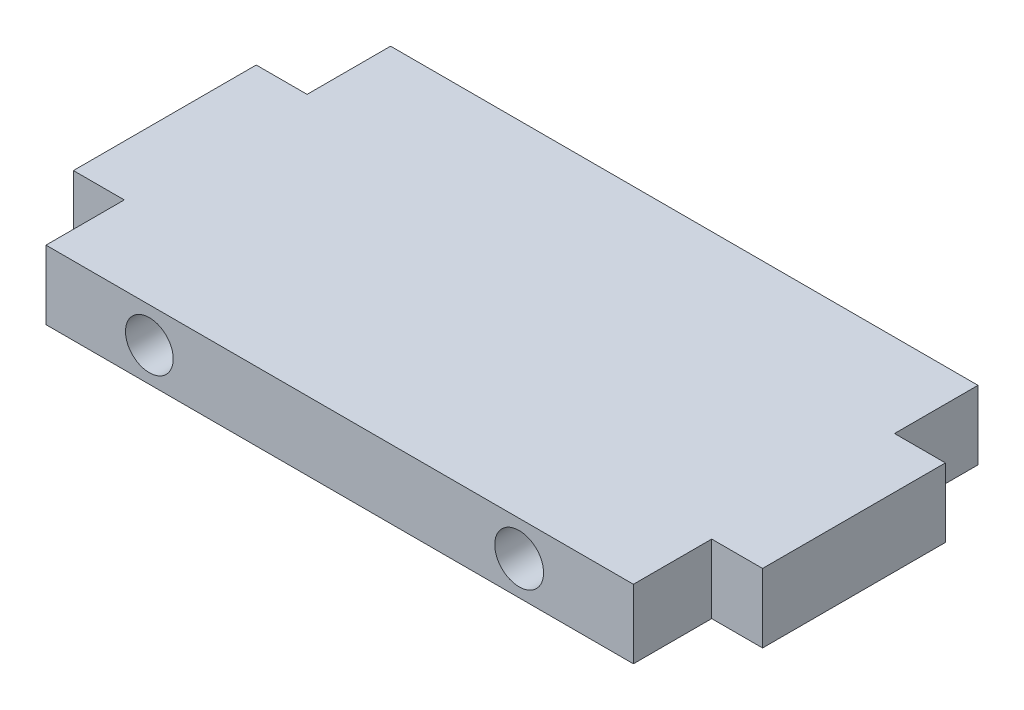
ISO-10303-21;
HEADER;
FILE_DESCRIPTION(('STEP AP214'),'2;1');
FILE_NAME('part.step','',(''),(''),'','','');
FILE_SCHEMA(('AUTOMOTIVE_DESIGN { 1 0 10303 214 1 1 1 1 }'));
ENDSEC;
DATA;
#1=APPLICATION_CONTEXT('core data for automotive mechanical design processes');
#2=APPLICATION_PROTOCOL_DEFINITION('international standard','automotive_design',2000,#1);
#3=PRODUCT_CONTEXT('',#1,'mechanical');
#4=PRODUCT('Part','Part','',(#3));
#5=PRODUCT_RELATED_PRODUCT_CATEGORY('part','',(#4));
#6=PRODUCT_DEFINITION_FORMATION('','',#4);
#7=PRODUCT_DEFINITION_CONTEXT('part definition',#1,'design');
#8=PRODUCT_DEFINITION('design','',#6,#7);
#9=PRODUCT_DEFINITION_SHAPE('','',#8);
#10=(LENGTH_UNIT() NAMED_UNIT(*) SI_UNIT(.MILLI.,.METRE.));
#11=(NAMED_UNIT(*) PLANE_ANGLE_UNIT() SI_UNIT($,.RADIAN.));
#12=(NAMED_UNIT(*) SI_UNIT($,.STERADIAN.) SOLID_ANGLE_UNIT());
#13=UNCERTAINTY_MEASURE_WITH_UNIT(LENGTH_MEASURE(1.E-05),#10,'distance_accuracy_value','');
#14=(GEOMETRIC_REPRESENTATION_CONTEXT(3) GLOBAL_UNCERTAINTY_ASSIGNED_CONTEXT((#13)) GLOBAL_UNIT_ASSIGNED_CONTEXT((#10,
#11,#12)) REPRESENTATION_CONTEXT('',''));
#15=CARTESIAN_POINT('',(0.,0.,0.));
#16=DIRECTION('',(0.,0.,1.));
#17=DIRECTION('',(1.,0.,0.));
#18=AXIS2_PLACEMENT_3D('',#15,#16,#17);
#19=CARTESIAN_POINT('',(-100.098911353033,-20.32,-40.9353032659408));
#20=DIRECTION('',(-1.,0.,0.));
#21=DIRECTION('',(0.,0.,1.));
#22=AXIS2_PLACEMENT_3D('',#19,#20,#21);
#23=PLANE('',#22);
#24=DIRECTION('',(0.,-1.,0.));
#25=VECTOR('',#24,1.);
#26=CARTESIAN_POINT('',(-100.098911353033,-20.32,22.5828458871156));
#27=LINE('',#26,#25);
#28=CARTESIAN_POINT('',(-100.098911353033,0.,22.5828458871156));
#29=VERTEX_POINT('',#28);
#30=CARTESIAN_POINT('',(-100.098911353033,-20.32,22.5828458871156));
#31=VERTEX_POINT('',#30);
#32=EDGE_CURVE('E195',#29,#31,#27,.T.);
#33=ORIENTED_EDGE('',*,*,#32,.F.);
#34=DIRECTION('',(0.,0.,1.));
#35=VECTOR('',#34,1.);
#36=CARTESIAN_POINT('',(-100.098911353033,0.,-40.9353032659408));
#37=LINE('',#36,#35);
#38=CARTESIAN_POINT('',(-100.098911353033,0.,-31.3220629630276));
#39=VERTEX_POINT('',#38);
#40=EDGE_CURVE('E153',#39,#29,#37,.T.);
#41=ORIENTED_EDGE('',*,*,#40,.F.);
#42=DIRECTION('',(0.,-1.,0.));
#43=VECTOR('',#42,1.);
#44=CARTESIAN_POINT('',(-100.098911353033,-20.32,-31.3220629630276));
#45=LINE('',#44,#43);
#46=CARTESIAN_POINT('',(-100.098911353033,-20.32,-31.3220629630276));
#47=VERTEX_POINT('',#46);
#48=EDGE_CURVE('E192',#39,#47,#45,.T.);
#49=ORIENTED_EDGE('',*,*,#48,.T.);
#50=DIRECTION('',(0.,0.,1.));
#51=VECTOR('',#50,1.);
#52=CARTESIAN_POINT('',(-100.098911353033,-20.32,-40.9353032659408));
#53=LINE('',#52,#51);
#54=EDGE_CURVE('E210',#47,#31,#53,.T.);
#55=ORIENTED_EDGE('',*,*,#54,.T.);
#56=EDGE_LOOP('',(#33,#41,#49,#55));
#57=FACE_BOUND('',#56,.T.);
#58=ADVANCED_FACE('F37',(#57),#23,.T.);
#59=CARTESIAN_POINT('',(103.101088646967,-20.32,-40.9353032659408));
#60=DIRECTION('',(1.,0.,0.));
#61=DIRECTION('',(0.,0.,-1.));
#62=AXIS2_PLACEMENT_3D('',#59,#60,#61);
#63=PLANE('',#62);
#64=DIRECTION('',(0.,-1.,0.));
#65=VECTOR('',#64,1.);
#66=CARTESIAN_POINT('',(103.101088646967,-20.32,-31.3220629630276));
#67=LINE('',#66,#65);
#68=CARTESIAN_POINT('',(103.101088646967,0.,-31.3220629630276));
#69=VERTEX_POINT('',#68);
#70=CARTESIAN_POINT('',(103.101088646967,-20.32,-31.3220629630276));
#71=VERTEX_POINT('',#70);
#72=EDGE_CURVE('E200',#69,#71,#67,.T.);
#73=ORIENTED_EDGE('',*,*,#72,.F.);
#74=DIRECTION('',(0.,0.,-1.));
#75=VECTOR('',#74,1.);
#76=CARTESIAN_POINT('',(103.101088646967,0.,-40.9353032659408));
#77=LINE('',#76,#75);
#78=CARTESIAN_POINT('',(103.101088646967,0.,22.5828458871156));
#79=VERTEX_POINT('',#78);
#80=EDGE_CURVE('E202',#79,#69,#77,.T.);
#81=ORIENTED_EDGE('',*,*,#80,.F.);
#82=DIRECTION('',(0.,-1.,0.));
#83=VECTOR('',#82,1.);
#84=CARTESIAN_POINT('',(103.101088646967,-20.32,22.5828458871156));
#85=LINE('',#84,#83);
#86=CARTESIAN_POINT('',(103.101088646967,-20.32,22.5828458871156));
#87=VERTEX_POINT('',#86);
#88=EDGE_CURVE('E197',#79,#87,#85,.T.);
#89=ORIENTED_EDGE('',*,*,#88,.T.);
#90=DIRECTION('',(0.,0.,-1.));
#91=VECTOR('',#90,1.);
#92=CARTESIAN_POINT('',(103.101088646967,-20.32,-40.9353032659408));
#93=LINE('',#92,#91);
#94=EDGE_CURVE('E203',#87,#71,#93,.T.);
#95=ORIENTED_EDGE('',*,*,#94,.T.);
#96=EDGE_LOOP('',(#73,#81,#89,#95));
#97=FACE_BOUND('',#96,.T.);
#98=ADVANCED_FACE('F39',(#97),#63,.T.);
#99=CARTESIAN_POINT('',(88.1010886469673,-20.32,30.6646967340591));
#100=DIRECTION('',(0.,1.,0.));
#101=DIRECTION('',(0.,0.,1.));
#102=AXIS2_PLACEMENT_3D('',#99,#100,#101);
#103=PLANE('',#102);
#104=DIRECTION('',(0.,0.,1.));
#105=VECTOR('',#104,1.);
#106=CARTESIAN_POINT('',(88.1010886469672,-20.32,-55.9353032659409));
#107=LINE('',#106,#105);
#108=CARTESIAN_POINT('',(88.1010886469672,-20.32,-55.9353032659409));
#109=VERTEX_POINT('',#108);
#110=CARTESIAN_POINT('',(88.1010886469672,-20.32,-31.3220629630276));
#111=VERTEX_POINT('',#110);
#112=EDGE_CURVE('E173',#109,#111,#107,.T.);
#113=ORIENTED_EDGE('',*,*,#112,.T.);
#114=DIRECTION('',(1.,0.,0.));
#115=VECTOR('',#114,1.);
#116=CARTESIAN_POINT('',(88.1010886469672,-20.32,-31.3220629630276));
#117=LINE('',#116,#115);
#118=EDGE_CURVE('E178',#111,#71,#117,.T.);
#119=ORIENTED_EDGE('',*,*,#118,.T.);
#120=ORIENTED_EDGE('',*,*,#94,.F.);
#121=DIRECTION('',(1.,0.,0.));
#122=VECTOR('',#121,1.);
#123=CARTESIAN_POINT('',(88.1010886469672,-20.32,22.5828458871156));
#124=LINE('',#123,#122);
#125=CARTESIAN_POINT('',(88.1010886469672,-20.32,22.5828458871156));
#126=VERTEX_POINT('',#125);
#127=EDGE_CURVE('E167',#126,#87,#124,.T.);
#128=ORIENTED_EDGE('',*,*,#127,.F.);
#129=DIRECTION('',(0.,0.,-1.));
#130=VECTOR('',#129,1.);
#131=CARTESIAN_POINT('',(88.1010886469672,-20.32,45.6646967340591));
#132=LINE('',#131,#130);
#133=CARTESIAN_POINT('',(88.1010886469672,-20.32,45.6646967340591));
#134=VERTEX_POINT('',#133);
#135=EDGE_CURVE('E162',#134,#126,#132,.T.);
#136=ORIENTED_EDGE('',*,*,#135,.F.);
#137=DIRECTION('',(1.,0.,0.));
#138=VECTOR('',#137,1.);
#139=CARTESIAN_POINT('',(-85.0989113530325,-20.32,45.6646967340591));
#140=LINE('',#139,#138);
#141=CARTESIAN_POINT('',(-85.0989113530325,-20.32,45.6646967340591));
#142=VERTEX_POINT('',#141);
#143=EDGE_CURVE('E213',#142,#134,#140,.T.);
#144=ORIENTED_EDGE('',*,*,#143,.F.);
#145=DIRECTION('',(0.,0.,-1.));
#146=VECTOR('',#145,1.);
#147=CARTESIAN_POINT('',(-85.0989113530325,-20.32,45.6646967340591));
#148=LINE('',#147,#146);
#149=CARTESIAN_POINT('',(-85.0989113530325,-20.32,22.5828458871156));
#150=VERTEX_POINT('',#149);
#151=EDGE_CURVE('E139',#142,#150,#148,.T.);
#152=ORIENTED_EDGE('',*,*,#151,.T.);
#153=DIRECTION('',(-1.,0.,0.));
#154=VECTOR('',#153,1.);
#155=CARTESIAN_POINT('',(-85.0989113530325,-20.32,22.5828458871156));
#156=LINE('',#155,#154);
#157=EDGE_CURVE('E136',#150,#31,#156,.T.);
#158=ORIENTED_EDGE('',*,*,#157,.T.);
#159=ORIENTED_EDGE('',*,*,#54,.F.);
#160=DIRECTION('',(-1.,0.,0.));
#161=VECTOR('',#160,1.);
#162=CARTESIAN_POINT('',(-85.0989113530327,-20.32,-31.3220629630276));
#163=LINE('',#162,#161);
#164=CARTESIAN_POINT('',(-85.0989113530327,-20.32,-31.3220629630276));
#165=VERTEX_POINT('',#164);
#166=EDGE_CURVE('E184',#165,#47,#163,.T.);
#167=ORIENTED_EDGE('',*,*,#166,.F.);
#168=DIRECTION('',(0.,0.,1.));
#169=VECTOR('',#168,1.);
#170=CARTESIAN_POINT('',(-85.0989113530327,-20.32,-55.9353032659409));
#171=LINE('',#170,#169);
#172=CARTESIAN_POINT('',(-85.0989113530327,-20.32,-55.9353032659409));
#173=VERTEX_POINT('',#172);
#174=EDGE_CURVE('E186',#173,#165,#171,.T.);
#175=ORIENTED_EDGE('',*,*,#174,.F.);
#176=DIRECTION('',(-1.,0.,0.));
#177=VECTOR('',#176,1.);
#178=CARTESIAN_POINT('',(-85.0989113530325,-20.32,-55.9353032659409));
#179=LINE('',#178,#177);
#180=EDGE_CURVE('E206',#109,#173,#179,.T.);
#181=ORIENTED_EDGE('',*,*,#180,.F.);
#182=EDGE_LOOP('',(#113,#119,#120,#128,#136,#144,#152,#158,#159,#167,#175,#181));
#183=FACE_BOUND('',#182,.T.);
#184=ADVANCED_FACE('F253',(#183),#103,.F.);
#185=CARTESIAN_POINT('',(88.1010886469673,0.,30.6646967340591));
#186=DIRECTION('',(0.,1.,0.));
#187=DIRECTION('',(0.,0.,1.));
#188=AXIS2_PLACEMENT_3D('',#185,#186,#187);
#189=PLANE('',#188);
#190=DIRECTION('',(1.,0.,0.));
#191=VECTOR('',#190,1.);
#192=CARTESIAN_POINT('',(88.1010886469672,0.,-31.3220629630276));
#193=LINE('',#192,#191);
#194=CARTESIAN_POINT('',(88.1010886469672,0.,-31.3220629630276));
#195=VERTEX_POINT('',#194);
#196=EDGE_CURVE('E163',#195,#69,#193,.T.);
#197=ORIENTED_EDGE('',*,*,#196,.F.);
#198=DIRECTION('',(0.,0.,1.));
#199=VECTOR('',#198,1.);
#200=CARTESIAN_POINT('',(88.1010886469672,0.,-55.9353032659409));
#201=LINE('',#200,#199);
#202=CARTESIAN_POINT('',(88.1010886469672,0.,-55.9353032659409));
#203=VERTEX_POINT('',#202);
#204=EDGE_CURVE('E175',#203,#195,#201,.T.);
#205=ORIENTED_EDGE('',*,*,#204,.F.);
#206=DIRECTION('',(-1.,0.,0.));
#207=VECTOR('',#206,1.);
#208=CARTESIAN_POINT('',(-85.0989113530325,0.,-55.9353032659409));
#209=LINE('',#208,#207);
#210=CARTESIAN_POINT('',(-85.0989113530327,0.,-55.9353032659409));
#211=VERTEX_POINT('',#210);
#212=EDGE_CURVE('E218',#203,#211,#209,.T.);
#213=ORIENTED_EDGE('',*,*,#212,.T.);
#214=DIRECTION('',(0.,0.,1.));
#215=VECTOR('',#214,1.);
#216=CARTESIAN_POINT('',(-85.0989113530327,0.,-55.9353032659409));
#217=LINE('',#216,#215);
#218=CARTESIAN_POINT('',(-85.0989113530327,0.,-31.3220629630276));
#219=VERTEX_POINT('',#218);
#220=EDGE_CURVE('E155',#211,#219,#217,.T.);
#221=ORIENTED_EDGE('',*,*,#220,.T.);
#222=DIRECTION('',(-1.,0.,0.));
#223=VECTOR('',#222,1.);
#224=CARTESIAN_POINT('',(-85.0989113530327,0.,-31.3220629630276));
#225=LINE('',#224,#223);
#226=EDGE_CURVE('E62',#219,#39,#225,.T.);
#227=ORIENTED_EDGE('',*,*,#226,.T.);
#228=ORIENTED_EDGE('',*,*,#40,.T.);
#229=DIRECTION('',(-1.,0.,0.));
#230=VECTOR('',#229,1.);
#231=CARTESIAN_POINT('',(-85.0989113530325,0.,22.5828458871156));
#232=LINE('',#231,#230);
#233=CARTESIAN_POINT('',(-85.0989113530325,0.,22.5828458871156));
#234=VERTEX_POINT('',#233);
#235=EDGE_CURVE('E133',#234,#29,#232,.T.);
#236=ORIENTED_EDGE('',*,*,#235,.F.);
#237=DIRECTION('',(0.,0.,-1.));
#238=VECTOR('',#237,1.);
#239=CARTESIAN_POINT('',(-85.0989113530325,0.,45.6646967340591));
#240=LINE('',#239,#238);
#241=CARTESIAN_POINT('',(-85.0989113530325,0.,45.6646967340591));
#242=VERTEX_POINT('',#241);
#243=EDGE_CURVE('E142',#242,#234,#240,.T.);
#244=ORIENTED_EDGE('',*,*,#243,.F.);
#245=DIRECTION('',(1.,0.,0.));
#246=VECTOR('',#245,1.);
#247=CARTESIAN_POINT('',(-85.0989113530325,0.,45.6646967340591));
#248=LINE('',#247,#246);
#249=CARTESIAN_POINT('',(88.1010886469672,0.,45.6646967340591));
#250=VERTEX_POINT('',#249);
#251=EDGE_CURVE('E207',#242,#250,#248,.T.);
#252=ORIENTED_EDGE('',*,*,#251,.T.);
#253=DIRECTION('',(0.,0.,-1.));
#254=VECTOR('',#253,1.);
#255=CARTESIAN_POINT('',(88.1010886469672,0.,45.6646967340591));
#256=LINE('',#255,#254);
#257=CARTESIAN_POINT('',(88.1010886469673,0.,22.5828458871156));
#258=VERTEX_POINT('',#257);
#259=EDGE_CURVE('E164',#250,#258,#256,.T.);
#260=ORIENTED_EDGE('',*,*,#259,.T.);
#261=DIRECTION('',(1.,0.,0.));
#262=VECTOR('',#261,1.);
#263=CARTESIAN_POINT('',(88.1010886469672,0.,22.5828458871156));
#264=LINE('',#263,#262);
#265=EDGE_CURVE('E54',#258,#79,#264,.T.);
#266=ORIENTED_EDGE('',*,*,#265,.T.);
#267=ORIENTED_EDGE('',*,*,#80,.T.);
#268=EDGE_LOOP('',(#197,#205,#213,#221,#227,#228,#236,#244,#252,#260,#266,#267));
#269=FACE_BOUND('',#268,.T.);
#270=ADVANCED_FACE('F151',(#269),#189,.T.);
#271=CARTESIAN_POINT('',(-85.0989113530325,-20.32,45.6646967340591));
#272=DIRECTION('',(0.,0.,1.));
#273=DIRECTION('',(1.,0.,0.));
#274=AXIS2_PLACEMENT_3D('',#271,#272,#273);
#275=PLANE('',#274);
#276=CARTESIAN_POINT('',(-54.6243349143324,-10.3131389455966,45.6646967340591));
#277=DIRECTION('',(0.,0.,1.));
#278=DIRECTION('',(1.,0.,0.));
#279=AXIS2_PLACEMENT_3D('',#276,#277,#278);
#280=CIRCLE('',#279,7.0393960649716);
#281=CARTESIAN_POINT('',(-47.5849388493608,-10.3131389455966,45.6646967340591));
#282=VERTEX_POINT('',#281);
#283=EDGE_CURVE('E295',#282,#282,#280,.T.);
#284=ORIENTED_EDGE('',*,*,#283,.F.);
#285=EDGE_LOOP('',(#284));
#286=FACE_BOUND('',#285,.T.);
#287=CARTESIAN_POINT('',(54.4105943507301,-10.3131389455966,45.6646967340591));
#288=DIRECTION('',(0.,0.,1.));
#289=DIRECTION('',(1.,0.,0.));
#290=AXIS2_PLACEMENT_3D('',#287,#288,#289);
#291=CIRCLE('',#290,7.19915939644469);
#292=CARTESIAN_POINT('',(61.6097537471748,-10.3131389455966,45.6646967340591));
#293=VERTEX_POINT('',#292);
#294=EDGE_CURVE('E297',#293,#293,#291,.T.);
#295=ORIENTED_EDGE('',*,*,#294,.F.);
#296=EDGE_LOOP('',(#295));
#297=FACE_BOUND('',#296,.T.);
#298=ORIENTED_EDGE('',*,*,#251,.F.);
#299=DIRECTION('',(0.,1.,0.));
#300=VECTOR('',#299,1.);
#301=CARTESIAN_POINT('',(-85.0989113530325,-20.32,45.6646967340591));
#302=LINE('',#301,#300);
#303=EDGE_CURVE('E46',#142,#242,#302,.T.);
#304=ORIENTED_EDGE('',*,*,#303,.F.);
#305=ORIENTED_EDGE('',*,*,#143,.T.);
#306=DIRECTION('',(0.,1.,0.));
#307=VECTOR('',#306,1.);
#308=CARTESIAN_POINT('',(88.1010886469672,-20.32,45.6646967340591));
#309=LINE('',#308,#307);
#310=EDGE_CURVE('E11',#134,#250,#309,.T.);
#311=ORIENTED_EDGE('',*,*,#310,.T.);
#312=EDGE_LOOP('',(#298,#304,#305,#311));
#313=FACE_BOUND('',#312,.T.);
#314=ADVANCED_FACE('F235',(#286,#297,#313),#275,.T.);
#315=CARTESIAN_POINT('',(-85.0989113530325,-20.32,-55.9353032659409));
#316=DIRECTION('',(0.,0.,-1.));
#317=DIRECTION('',(-1.,0.,0.));
#318=AXIS2_PLACEMENT_3D('',#315,#316,#317);
#319=PLANE('',#318);
#320=CARTESIAN_POINT('',(-54.6243349143324,-10.3131389455966,-55.9353032659409));
#321=DIRECTION('',(0.,0.,1.));
#322=DIRECTION('',(1.,0.,0.));
#323=AXIS2_PLACEMENT_3D('',#320,#321,#322);
#324=CIRCLE('',#323,7.0393960649716);
#325=CARTESIAN_POINT('',(-47.5849388493608,-10.3131389455966,-55.9353032659409));
#326=VERTEX_POINT('',#325);
#327=EDGE_CURVE('E292',#326,#326,#324,.T.);
#328=ORIENTED_EDGE('',*,*,#327,.T.);
#329=EDGE_LOOP('',(#328));
#330=FACE_BOUND('',#329,.T.);
#331=CARTESIAN_POINT('',(54.4105943507301,-10.3131389455966,-55.9353032659409));
#332=DIRECTION('',(0.,0.,1.));
#333=DIRECTION('',(1.,0.,0.));
#334=AXIS2_PLACEMENT_3D('',#331,#332,#333);
#335=CIRCLE('',#334,7.19915939644469);
#336=CARTESIAN_POINT('',(61.6097537471748,-10.3131389455966,-55.9353032659409));
#337=VERTEX_POINT('',#336);
#338=EDGE_CURVE('E174',#337,#337,#335,.T.);
#339=ORIENTED_EDGE('',*,*,#338,.T.);
#340=EDGE_LOOP('',(#339));
#341=FACE_BOUND('',#340,.T.);
#342=ORIENTED_EDGE('',*,*,#212,.F.);
#343=DIRECTION('',(0.,1.,0.));
#344=VECTOR('',#343,1.);
#345=CARTESIAN_POINT('',(88.1010886469672,-20.32,-55.9353032659409));
#346=LINE('',#345,#344);
#347=EDGE_CURVE('E41',#109,#203,#346,.T.);
#348=ORIENTED_EDGE('',*,*,#347,.F.);
#349=ORIENTED_EDGE('',*,*,#180,.T.);
#350=DIRECTION('',(0.,1.,0.));
#351=VECTOR('',#350,1.);
#352=CARTESIAN_POINT('',(-85.0989113530325,-20.32,-55.9353032659409));
#353=LINE('',#352,#351);
#354=EDGE_CURVE('E223',#173,#211,#353,.T.);
#355=ORIENTED_EDGE('',*,*,#354,.T.);
#356=EDGE_LOOP('',(#342,#348,#349,#355));
#357=FACE_BOUND('',#356,.T.);
#358=ADVANCED_FACE('F232',(#330,#341,#357),#319,.T.);
#359=CARTESIAN_POINT('',(-85.0989113530327,-20.32,-31.3220629630276));
#360=DIRECTION('',(0.,0.,-1.));
#361=DIRECTION('',(-1.,0.,0.));
#362=AXIS2_PLACEMENT_3D('',#359,#360,#361);
#363=PLANE('',#362);
#364=ORIENTED_EDGE('',*,*,#226,.F.);
#365=DIRECTION('',(0.,1.,0.));
#366=VECTOR('',#365,1.);
#367=CARTESIAN_POINT('',(-85.0989113530327,-20.32,-31.3220629630276));
#368=LINE('',#367,#366);
#369=EDGE_CURVE('E187',#165,#219,#368,.T.);
#370=ORIENTED_EDGE('',*,*,#369,.F.);
#371=ORIENTED_EDGE('',*,*,#166,.T.);
#372=ORIENTED_EDGE('',*,*,#48,.F.);
#373=EDGE_LOOP('',(#364,#370,#371,#372));
#374=FACE_BOUND('',#373,.T.);
#375=ADVANCED_FACE('F234',(#374),#363,.T.);
#376=CARTESIAN_POINT('',(-85.0989113530327,-20.32,-55.9353032659409));
#377=DIRECTION('',(-1.,0.,0.));
#378=DIRECTION('',(0.,0.,1.));
#379=AXIS2_PLACEMENT_3D('',#376,#377,#378);
#380=PLANE('',#379);
#381=ORIENTED_EDGE('',*,*,#220,.F.);
#382=ORIENTED_EDGE('',*,*,#354,.F.);
#383=ORIENTED_EDGE('',*,*,#174,.T.);
#384=ORIENTED_EDGE('',*,*,#369,.T.);
#385=EDGE_LOOP('',(#381,#382,#383,#384));
#386=FACE_BOUND('',#385,.T.);
#387=ADVANCED_FACE('F241',(#386),#380,.T.);
#388=CARTESIAN_POINT('',(-85.0989113530325,-20.32,22.5828458871156));
#389=DIRECTION('',(0.,0.,-1.));
#390=DIRECTION('',(-1.,0.,0.));
#391=AXIS2_PLACEMENT_3D('',#388,#389,#390);
#392=PLANE('',#391);
#393=ORIENTED_EDGE('',*,*,#32,.T.);
#394=ORIENTED_EDGE('',*,*,#157,.F.);
#395=DIRECTION('',(0.,1.,0.));
#396=VECTOR('',#395,1.);
#397=CARTESIAN_POINT('',(-85.0989113530325,-20.32,22.5828458871156));
#398=LINE('',#397,#396);
#399=EDGE_CURVE('E129',#150,#234,#398,.T.);
#400=ORIENTED_EDGE('',*,*,#399,.T.);
#401=ORIENTED_EDGE('',*,*,#235,.T.);
#402=EDGE_LOOP('',(#393,#394,#400,#401));
#403=FACE_BOUND('',#402,.T.);
#404=ADVANCED_FACE('F131',(#403),#392,.F.);
#405=CARTESIAN_POINT('',(-85.0989113530325,-20.32,45.6646967340591));
#406=DIRECTION('',(1.,0.,0.));
#407=DIRECTION('',(0.,0.,-1.));
#408=AXIS2_PLACEMENT_3D('',#405,#406,#407);
#409=PLANE('',#408);
#410=ORIENTED_EDGE('',*,*,#243,.T.);
#411=ORIENTED_EDGE('',*,*,#399,.F.);
#412=ORIENTED_EDGE('',*,*,#151,.F.);
#413=ORIENTED_EDGE('',*,*,#303,.T.);
#414=EDGE_LOOP('',(#410,#411,#412,#413));
#415=FACE_BOUND('',#414,.T.);
#416=ADVANCED_FACE('F143',(#415),#409,.F.);
#417=CARTESIAN_POINT('',(88.1010886469672,-20.32,22.5828458871156));
#418=DIRECTION('',(0.,0.,1.));
#419=DIRECTION('',(1.,0.,0.));
#420=AXIS2_PLACEMENT_3D('',#417,#418,#419);
#421=PLANE('',#420);
#422=ORIENTED_EDGE('',*,*,#265,.F.);
#423=DIRECTION('',(0.,1.,0.));
#424=VECTOR('',#423,1.);
#425=CARTESIAN_POINT('',(88.1010886469672,-20.32,22.5828458871156));
#426=LINE('',#425,#424);
#427=EDGE_CURVE('E160',#126,#258,#426,.T.);
#428=ORIENTED_EDGE('',*,*,#427,.F.);
#429=ORIENTED_EDGE('',*,*,#127,.T.);
#430=ORIENTED_EDGE('',*,*,#88,.F.);
#431=EDGE_LOOP('',(#422,#428,#429,#430));
#432=FACE_BOUND('',#431,.T.);
#433=ADVANCED_FACE('F274',(#432),#421,.T.);
#434=CARTESIAN_POINT('',(88.1010886469672,-20.32,45.6646967340591));
#435=DIRECTION('',(1.,0.,0.));
#436=DIRECTION('',(0.,0.,-1.));
#437=AXIS2_PLACEMENT_3D('',#434,#435,#436);
#438=PLANE('',#437);
#439=ORIENTED_EDGE('',*,*,#259,.F.);
#440=ORIENTED_EDGE('',*,*,#310,.F.);
#441=ORIENTED_EDGE('',*,*,#135,.T.);
#442=ORIENTED_EDGE('',*,*,#427,.T.);
#443=EDGE_LOOP('',(#439,#440,#441,#442));
#444=FACE_BOUND('',#443,.T.);
#445=ADVANCED_FACE('F270',(#444),#438,.T.);
#446=CARTESIAN_POINT('',(88.1010886469672,-20.32,-31.3220629630276));
#447=DIRECTION('',(0.,0.,1.));
#448=DIRECTION('',(1.,0.,0.));
#449=AXIS2_PLACEMENT_3D('',#446,#447,#448);
#450=PLANE('',#449);
#451=ORIENTED_EDGE('',*,*,#72,.T.);
#452=ORIENTED_EDGE('',*,*,#118,.F.);
#453=DIRECTION('',(0.,1.,0.));
#454=VECTOR('',#453,1.);
#455=CARTESIAN_POINT('',(88.1010886469672,-20.32,-31.3220629630276));
#456=LINE('',#455,#454);
#457=EDGE_CURVE('E171',#111,#195,#456,.T.);
#458=ORIENTED_EDGE('',*,*,#457,.T.);
#459=ORIENTED_EDGE('',*,*,#196,.T.);
#460=EDGE_LOOP('',(#451,#452,#458,#459));
#461=FACE_BOUND('',#460,.T.);
#462=ADVANCED_FACE('F267',(#461),#450,.F.);
#463=CARTESIAN_POINT('',(88.1010886469672,-20.32,-55.9353032659409));
#464=DIRECTION('',(-1.,0.,0.));
#465=DIRECTION('',(0.,0.,1.));
#466=AXIS2_PLACEMENT_3D('',#463,#464,#465);
#467=PLANE('',#466);
#468=ORIENTED_EDGE('',*,*,#204,.T.);
#469=ORIENTED_EDGE('',*,*,#457,.F.);
#470=ORIENTED_EDGE('',*,*,#112,.F.);
#471=ORIENTED_EDGE('',*,*,#347,.T.);
#472=EDGE_LOOP('',(#468,#469,#470,#471));
#473=FACE_BOUND('',#472,.T.);
#474=ADVANCED_FACE('F230',(#473),#467,.F.);
#475=CARTESIAN_POINT('',(54.4105943507301,-10.3131389455966,-55.9353032659409));
#476=DIRECTION('',(0.,0.,1.));
#477=DIRECTION('',(1.,0.,0.));
#478=AXIS2_PLACEMENT_3D('',#475,#476,#477);
#479=CYLINDRICAL_SURFACE('',#478,7.19915939644469);
#480=ORIENTED_EDGE('',*,*,#338,.F.);
#481=EDGE_LOOP('',(#480));
#482=FACE_BOUND('',#481,.T.);
#483=ORIENTED_EDGE('',*,*,#294,.T.);
#484=EDGE_LOOP('',(#483));
#485=FACE_BOUND('',#484,.T.);
#486=ADVANCED_FACE('F266',(#482,#485),#479,.F.);
#487=CARTESIAN_POINT('',(-54.6243349143324,-10.3131389455966,-55.9353032659409));
#488=DIRECTION('',(0.,0.,1.));
#489=DIRECTION('',(1.,0.,0.));
#490=AXIS2_PLACEMENT_3D('',#487,#488,#489);
#491=CYLINDRICAL_SURFACE('',#490,7.0393960649716);
#492=ORIENTED_EDGE('',*,*,#327,.F.);
#493=EDGE_LOOP('',(#492));
#494=FACE_BOUND('',#493,.T.);
#495=ORIENTED_EDGE('',*,*,#283,.T.);
#496=EDGE_LOOP('',(#495));
#497=FACE_BOUND('',#496,.T.);
#498=ADVANCED_FACE('F284',(#494,#497),#491,.F.);
#499=CLOSED_SHELL('',(#58,#98,#184,#270,#314,#358,#375,#387,#404,#416,#433,#445,#462,#474,#486,#498));
#500=MANIFOLD_SOLID_BREP('B2',#499);
#501=ADVANCED_BREP_SHAPE_REPRESENTATION('',(#18,#500),#14);
#502=SHAPE_DEFINITION_REPRESENTATION(#9,#501);
ENDSEC;
END-ISO-10303-21;
